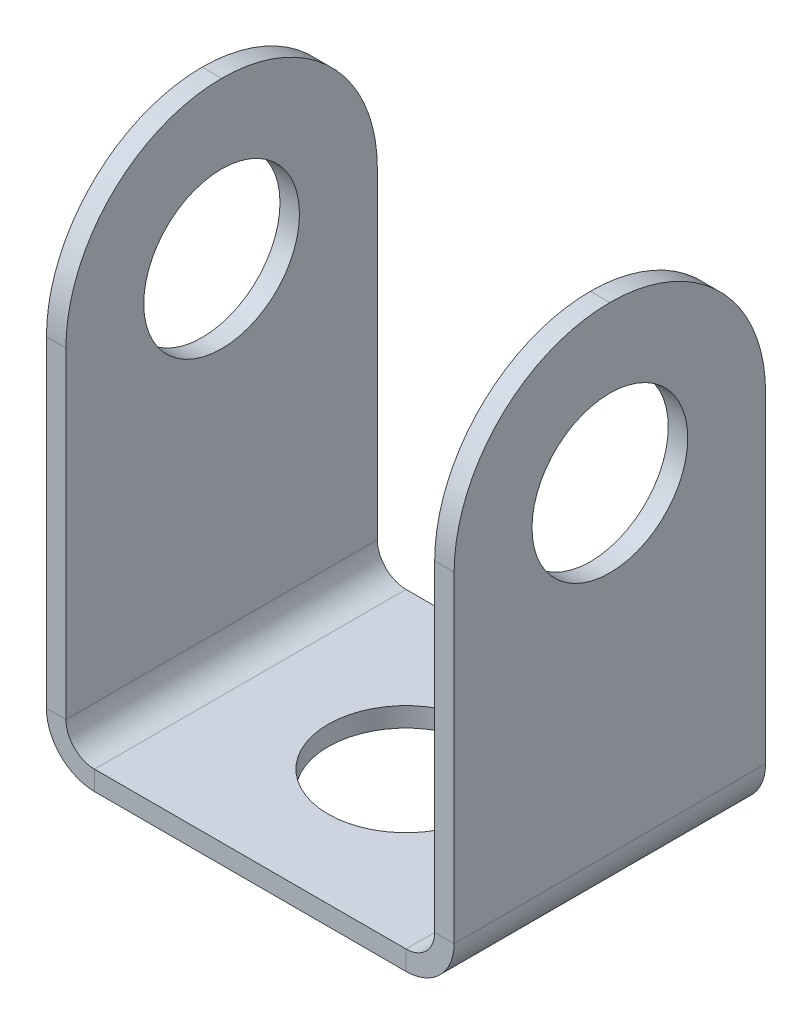
ISO-10303-21;
HEADER;
FILE_DESCRIPTION(('STEP AP214'),'2;1');
FILE_NAME('part.step','',(''),(''),'','','');
FILE_SCHEMA(('AUTOMOTIVE_DESIGN { 1 0 10303 214 1 1 1 1 }'));
ENDSEC;
DATA;
#1=APPLICATION_CONTEXT('core data for automotive mechanical design processes');
#2=APPLICATION_PROTOCOL_DEFINITION('international standard','automotive_design',2000,#1);
#3=PRODUCT_CONTEXT('',#1,'mechanical');
#4=PRODUCT('Part','Part','',(#3));
#5=PRODUCT_RELATED_PRODUCT_CATEGORY('part','',(#4));
#6=PRODUCT_DEFINITION_FORMATION('','',#4);
#7=PRODUCT_DEFINITION_CONTEXT('part definition',#1,'design');
#8=PRODUCT_DEFINITION('design','',#6,#7);
#9=PRODUCT_DEFINITION_SHAPE('','',#8);
#10=(LENGTH_UNIT() NAMED_UNIT(*) SI_UNIT(.MILLI.,.METRE.));
#11=(NAMED_UNIT(*) PLANE_ANGLE_UNIT() SI_UNIT($,.RADIAN.));
#12=(NAMED_UNIT(*) SI_UNIT($,.STERADIAN.) SOLID_ANGLE_UNIT());
#13=UNCERTAINTY_MEASURE_WITH_UNIT(LENGTH_MEASURE(1.E-05),#10,'distance_accuracy_value','');
#14=(GEOMETRIC_REPRESENTATION_CONTEXT(3) GLOBAL_UNCERTAINTY_ASSIGNED_CONTEXT((#13)) GLOBAL_UNIT_ASSIGNED_CONTEXT((#10,
#11,#12)) REPRESENTATION_CONTEXT('',''));
#15=CARTESIAN_POINT('',(0.,0.,0.));
#16=DIRECTION('',(0.,0.,1.));
#17=DIRECTION('',(1.,0.,0.));
#18=AXIS2_PLACEMENT_3D('',#15,#16,#17);
#19=CARTESIAN_POINT('',(-4.,0.5,-4.));
#20=DIRECTION('',(0.,0.,1.));
#21=DIRECTION('',(1.,0.,0.));
#22=AXIS2_PLACEMENT_3D('',#19,#20,#21);
#23=PLANE('',#22);
#24=DIRECTION('',(-1.,0.,0.));
#25=VECTOR('',#24,1.);
#26=CARTESIAN_POINT('',(-4.,0.,-4.));
#27=LINE('',#26,#25);
#28=CARTESIAN_POINT('',(4.,0.,-4.));
#29=VERTEX_POINT('',#28);
#30=CARTESIAN_POINT('',(-4.,0.,-4.));
#31=VERTEX_POINT('',#30);
#32=EDGE_CURVE('E276',#29,#31,#27,.T.);
#33=ORIENTED_EDGE('',*,*,#32,.T.);
#34=DIRECTION('',(0.,-1.,0.));
#35=VECTOR('',#34,1.);
#36=CARTESIAN_POINT('',(-4.,0.5,-4.));
#37=LINE('',#36,#35);
#38=CARTESIAN_POINT('',(-4.,0.5,-4.));
#39=VERTEX_POINT('',#38);
#40=EDGE_CURVE('E285',#39,#31,#37,.T.);
#41=ORIENTED_EDGE('',*,*,#40,.F.);
#42=DIRECTION('',(-1.,0.,0.));
#43=VECTOR('',#42,1.);
#44=CARTESIAN_POINT('',(-4.,0.5,-4.));
#45=LINE('',#44,#43);
#46=CARTESIAN_POINT('',(4.,0.5,-4.));
#47=VERTEX_POINT('',#46);
#48=EDGE_CURVE('E266',#47,#39,#45,.T.);
#49=ORIENTED_EDGE('',*,*,#48,.F.);
#50=DIRECTION('',(0.,-1.,0.));
#51=VECTOR('',#50,1.);
#52=CARTESIAN_POINT('',(4.,0.5,-4.));
#53=LINE('',#52,#51);
#54=EDGE_CURVE('E288',#47,#29,#53,.T.);
#55=ORIENTED_EDGE('',*,*,#54,.T.);
#56=EDGE_LOOP('',(#33,#41,#49,#55));
#57=FACE_BOUND('',#56,.T.);
#58=ADVANCED_FACE('F77',(#57),#23,.F.);
#59=CARTESIAN_POINT('',(-4.,0.5,4.));
#60=DIRECTION('',(0.,0.,-1.));
#61=DIRECTION('',(-1.,0.,0.));
#62=AXIS2_PLACEMENT_3D('',#59,#60,#61);
#63=PLANE('',#62);
#64=DIRECTION('',(1.,0.,0.));
#65=VECTOR('',#64,1.);
#66=CARTESIAN_POINT('',(-4.,0.,4.));
#67=LINE('',#66,#65);
#68=CARTESIAN_POINT('',(-4.,0.,4.));
#69=VERTEX_POINT('',#68);
#70=CARTESIAN_POINT('',(4.,0.,4.));
#71=VERTEX_POINT('',#70);
#72=EDGE_CURVE('E267',#69,#71,#67,.T.);
#73=ORIENTED_EDGE('',*,*,#72,.T.);
#74=DIRECTION('',(0.,-1.,0.));
#75=VECTOR('',#74,1.);
#76=CARTESIAN_POINT('',(4.,0.5,4.));
#77=LINE('',#76,#75);
#78=CARTESIAN_POINT('',(4.,0.5,4.));
#79=VERTEX_POINT('',#78);
#80=EDGE_CURVE('E273',#79,#71,#77,.T.);
#81=ORIENTED_EDGE('',*,*,#80,.F.);
#82=DIRECTION('',(1.,0.,0.));
#83=VECTOR('',#82,1.);
#84=CARTESIAN_POINT('',(-4.,0.5,4.));
#85=LINE('',#84,#83);
#86=CARTESIAN_POINT('',(-4.,0.5,4.));
#87=VERTEX_POINT('',#86);
#88=EDGE_CURVE('E271',#87,#79,#85,.T.);
#89=ORIENTED_EDGE('',*,*,#88,.F.);
#90=DIRECTION('',(0.,-1.,0.));
#91=VECTOR('',#90,1.);
#92=CARTESIAN_POINT('',(-4.,0.5,4.));
#93=LINE('',#92,#91);
#94=EDGE_CURVE('E282',#87,#69,#93,.T.);
#95=ORIENTED_EDGE('',*,*,#94,.T.);
#96=EDGE_LOOP('',(#73,#81,#89,#95));
#97=FACE_BOUND('',#96,.T.);
#98=ADVANCED_FACE('F363',(#97),#63,.F.);
#99=CARTESIAN_POINT('',(0.,0.5,0.));
#100=DIRECTION('',(0.,1.,0.));
#101=DIRECTION('',(0.,0.,1.));
#102=AXIS2_PLACEMENT_3D('',#99,#100,#101);
#103=PLANE('',#102);
#104=CARTESIAN_POINT('',(0.,0.5,0.));
#105=DIRECTION('',(0.,1.,0.));
#106=DIRECTION('',(0.,0.,1.));
#107=AXIS2_PLACEMENT_3D('',#104,#105,#106);
#108=CIRCLE('',#107,2.);
#109=CARTESIAN_POINT('',(0.,0.5,2.));
#110=VERTEX_POINT('',#109);
#111=EDGE_CURVE('E216',#110,#110,#108,.T.);
#112=ORIENTED_EDGE('',*,*,#111,.F.);
#113=EDGE_LOOP('',(#112));
#114=FACE_BOUND('',#113,.T.);
#115=DIRECTION('',(0.,0.,-1.));
#116=VECTOR('',#115,1.);
#117=CARTESIAN_POINT('',(4.,0.5,-4.));
#118=LINE('',#117,#116);
#119=EDGE_CURVE('E263',#79,#47,#118,.T.);
#120=ORIENTED_EDGE('',*,*,#119,.T.);
#121=ORIENTED_EDGE('',*,*,#48,.T.);
#122=DIRECTION('',(0.,0.,1.));
#123=VECTOR('',#122,1.);
#124=CARTESIAN_POINT('',(-4.,0.5,-4.));
#125=LINE('',#124,#123);
#126=EDGE_CURVE('E269',#39,#87,#125,.T.);
#127=ORIENTED_EDGE('',*,*,#126,.T.);
#128=ORIENTED_EDGE('',*,*,#88,.T.);
#129=EDGE_LOOP('',(#120,#121,#127,#128));
#130=FACE_BOUND('',#129,.T.);
#131=ADVANCED_FACE('F359',(#114,#130),#103,.T.);
#132=CARTESIAN_POINT('',(0.,0.,0.));
#133=DIRECTION('',(0.,1.,0.));
#134=DIRECTION('',(0.,0.,1.));
#135=AXIS2_PLACEMENT_3D('',#132,#133,#134);
#136=PLANE('',#135);
#137=CARTESIAN_POINT('',(0.,0.,0.));
#138=DIRECTION('',(0.,1.,0.));
#139=DIRECTION('',(0.,0.,1.));
#140=AXIS2_PLACEMENT_3D('',#137,#138,#139);
#141=CIRCLE('',#140,2.);
#142=CARTESIAN_POINT('',(0.,0.,2.));
#143=VERTEX_POINT('',#142);
#144=EDGE_CURVE('E315',#143,#143,#141,.T.);
#145=ORIENTED_EDGE('',*,*,#144,.T.);
#146=EDGE_LOOP('',(#145));
#147=FACE_BOUND('',#146,.T.);
#148=DIRECTION('',(0.,0.,-1.));
#149=VECTOR('',#148,1.);
#150=CARTESIAN_POINT('',(4.,0.,-4.));
#151=LINE('',#150,#149);
#152=EDGE_CURVE('E254',#71,#29,#151,.T.);
#153=ORIENTED_EDGE('',*,*,#152,.F.);
#154=ORIENTED_EDGE('',*,*,#72,.F.);
#155=DIRECTION('',(0.,0.,1.));
#156=VECTOR('',#155,1.);
#157=CARTESIAN_POINT('',(-4.,0.,-4.));
#158=LINE('',#157,#156);
#159=EDGE_CURVE('E189',#31,#69,#158,.T.);
#160=ORIENTED_EDGE('',*,*,#159,.F.);
#161=ORIENTED_EDGE('',*,*,#32,.F.);
#162=EDGE_LOOP('',(#153,#154,#160,#161));
#163=FACE_BOUND('',#162,.T.);
#164=ADVANCED_FACE('F405',(#147,#163),#136,.F.);
#165=CARTESIAN_POINT('',(4.,1.2366,4.));
#166=DIRECTION('',(0.,0.,1.));
#167=DIRECTION('',(0.,-1.,0.));
#168=AXIS2_PLACEMENT_3D('',#165,#166,#167);
#169=PLANE('',#168);
#170=DIRECTION('',(-1.,0.,0.));
#171=VECTOR('',#170,1.);
#172=CARTESIAN_POINT('',(5.2366,1.2366,4.));
#173=LINE('',#172,#171);
#174=CARTESIAN_POINT('',(4.7366,1.2366,4.));
#175=VERTEX_POINT('',#174);
#176=CARTESIAN_POINT('',(5.2366,1.2366,4.));
#177=VERTEX_POINT('',#176);
#178=EDGE_CURVE('E226',#175,#177,#173,.F.);
#179=ORIENTED_EDGE('',*,*,#178,.F.);
#180=CARTESIAN_POINT('',(4.,1.2366,4.));
#181=DIRECTION('',(0.,0.,-1.));
#182=DIRECTION('',(0.,1.,0.));
#183=AXIS2_PLACEMENT_3D('',#180,#181,#182);
#184=CIRCLE('',#183,0.736600000000001);
#185=EDGE_CURVE('E258',#79,#175,#184,.F.);
#186=ORIENTED_EDGE('',*,*,#185,.F.);
#187=ORIENTED_EDGE('',*,*,#80,.T.);
#188=CARTESIAN_POINT('',(4.,1.2366,4.));
#189=DIRECTION('',(0.,0.,-1.));
#190=DIRECTION('',(0.,1.,0.));
#191=AXIS2_PLACEMENT_3D('',#188,#189,#190);
#192=CIRCLE('',#191,1.2366);
#193=EDGE_CURVE('E251',#71,#177,#192,.F.);
#194=ORIENTED_EDGE('',*,*,#193,.T.);
#195=EDGE_LOOP('',(#179,#186,#187,#194));
#196=FACE_BOUND('',#195,.T.);
#197=ADVANCED_FACE('F375',(#196),#169,.T.);
#198=CARTESIAN_POINT('',(4.,1.2366,-4.));
#199=DIRECTION('',(0.,0.,1.));
#200=DIRECTION('',(0.,-1.,0.));
#201=AXIS2_PLACEMENT_3D('',#198,#199,#200);
#202=PLANE('',#201);
#203=CARTESIAN_POINT('',(4.,1.2366,-4.));
#204=DIRECTION('',(0.,0.,-1.));
#205=DIRECTION('',(0.,1.,0.));
#206=AXIS2_PLACEMENT_3D('',#203,#204,#205);
#207=CIRCLE('',#206,0.736600000000001);
#208=CARTESIAN_POINT('',(4.7366,1.2366,-4.));
#209=VERTEX_POINT('',#208);
#210=EDGE_CURVE('E233',#209,#47,#207,.T.);
#211=ORIENTED_EDGE('',*,*,#210,.F.);
#212=DIRECTION('',(-1.,0.,0.));
#213=VECTOR('',#212,1.);
#214=CARTESIAN_POINT('',(4.7366,1.2366,-4.));
#215=LINE('',#214,#213);
#216=CARTESIAN_POINT('',(5.2366,1.23659999999999,-4.));
#217=VERTEX_POINT('',#216);
#218=EDGE_CURVE('E244',#209,#217,#215,.F.);
#219=ORIENTED_EDGE('',*,*,#218,.T.);
#220=CARTESIAN_POINT('',(4.,1.2366,-4.));
#221=DIRECTION('',(0.,0.,-1.));
#222=DIRECTION('',(0.,1.,0.));
#223=AXIS2_PLACEMENT_3D('',#220,#221,#222);
#224=CIRCLE('',#223,1.2366);
#225=EDGE_CURVE('E255',#217,#29,#224,.T.);
#226=ORIENTED_EDGE('',*,*,#225,.T.);
#227=ORIENTED_EDGE('',*,*,#54,.F.);
#228=EDGE_LOOP('',(#211,#219,#226,#227));
#229=FACE_BOUND('',#228,.T.);
#230=ADVANCED_FACE('F398',(#229),#202,.F.);
#231=CARTESIAN_POINT('',(4.,1.2366,-4.));
#232=DIRECTION('',(0.,0.,-1.));
#233=DIRECTION('',(1.,0.,0.));
#234=AXIS2_PLACEMENT_3D('',#231,#232,#233);
#235=CYLINDRICAL_SURFACE('',#234,1.2366);
#236=ORIENTED_EDGE('',*,*,#152,.T.);
#237=ORIENTED_EDGE('',*,*,#225,.F.);
#238=DIRECTION('',(0.,0.,-1.));
#239=VECTOR('',#238,1.);
#240=CARTESIAN_POINT('',(5.2366,1.2366,4.));
#241=LINE('',#240,#239);
#242=EDGE_CURVE('E241',#217,#177,#241,.F.);
#243=ORIENTED_EDGE('',*,*,#242,.T.);
#244=ORIENTED_EDGE('',*,*,#193,.F.);
#245=EDGE_LOOP('',(#236,#237,#243,#244));
#246=FACE_BOUND('',#245,.T.);
#247=ADVANCED_FACE('F402',(#246),#235,.T.);
#248=CARTESIAN_POINT('',(4.,1.2366,-4.));
#249=DIRECTION('',(0.,0.,-1.));
#250=DIRECTION('',(1.,0.,0.));
#251=AXIS2_PLACEMENT_3D('',#248,#249,#250);
#252=CYLINDRICAL_SURFACE('',#251,0.736600000000001);
#253=ORIENTED_EDGE('',*,*,#119,.F.);
#254=ORIENTED_EDGE('',*,*,#185,.T.);
#255=DIRECTION('',(0.,0.,-1.));
#256=VECTOR('',#255,1.);
#257=CARTESIAN_POINT('',(4.7366,1.2366,4.));
#258=LINE('',#257,#256);
#259=EDGE_CURVE('E247',#175,#209,#258,.T.);
#260=ORIENTED_EDGE('',*,*,#259,.T.);
#261=ORIENTED_EDGE('',*,*,#210,.T.);
#262=EDGE_LOOP('',(#253,#254,#260,#261));
#263=FACE_BOUND('',#262,.T.);
#264=ADVANCED_FACE('F370',(#263),#252,.F.);
#265=CARTESIAN_POINT('',(5.2366,0.499999999999998,4.));
#266=DIRECTION('',(0.,0.,-1.));
#267=DIRECTION('',(-1.,0.,0.));
#268=AXIS2_PLACEMENT_3D('',#265,#266,#267);
#269=PLANE('',#268);
#270=DIRECTION('',(0.,-1.,0.));
#271=VECTOR('',#270,1.);
#272=CARTESIAN_POINT('',(5.23659999999999,0.,4.));
#273=LINE('',#272,#271);
#274=CARTESIAN_POINT('',(5.23660000000003,9.5,4.));
#275=VERTEX_POINT('',#274);
#276=EDGE_CURVE('E234',#275,#177,#273,.T.);
#277=ORIENTED_EDGE('',*,*,#276,.F.);
#278=DIRECTION('',(-1.,0.,0.));
#279=VECTOR('',#278,1.);
#280=CARTESIAN_POINT('',(5.23660000000003,9.5,4.));
#281=LINE('',#280,#279);
#282=CARTESIAN_POINT('',(4.73660000000003,9.5,4.));
#283=VERTEX_POINT('',#282);
#284=EDGE_CURVE('E86',#275,#283,#281,.T.);
#285=ORIENTED_EDGE('',*,*,#284,.T.);
#286=DIRECTION('',(0.,1.,0.));
#287=VECTOR('',#286,1.);
#288=CARTESIAN_POINT('',(4.7366,0.5,4.));
#289=LINE('',#288,#287);
#290=EDGE_CURVE('E239',#283,#175,#289,.F.);
#291=ORIENTED_EDGE('',*,*,#290,.T.);
#292=ORIENTED_EDGE('',*,*,#178,.T.);
#293=EDGE_LOOP('',(#277,#285,#291,#292));
#294=FACE_BOUND('',#293,.T.);
#295=ADVANCED_FACE('F378',(#294),#269,.F.);
#296=CARTESIAN_POINT('',(5.23660000000004,13.5,-4.));
#297=DIRECTION('',(0.,0.,1.));
#298=DIRECTION('',(1.,0.,0.));
#299=AXIS2_PLACEMENT_3D('',#296,#297,#298);
#300=PLANE('',#299);
#301=DIRECTION('',(0.,-1.,0.));
#302=VECTOR('',#301,1.);
#303=CARTESIAN_POINT('',(4.73660000000004,13.5,-4.));
#304=LINE('',#303,#302);
#305=CARTESIAN_POINT('',(4.73660000000003,9.5,-4.));
#306=VERTEX_POINT('',#305);
#307=EDGE_CURVE('E236',#209,#306,#304,.F.);
#308=ORIENTED_EDGE('',*,*,#307,.T.);
#309=DIRECTION('',(-1.,0.,0.));
#310=VECTOR('',#309,1.);
#311=CARTESIAN_POINT('',(5.23660000000003,9.5,-4.));
#312=LINE('',#311,#310);
#313=CARTESIAN_POINT('',(5.23660000000003,9.5,-4.));
#314=VERTEX_POINT('',#313);
#315=EDGE_CURVE('E294',#306,#314,#312,.F.);
#316=ORIENTED_EDGE('',*,*,#315,.T.);
#317=DIRECTION('',(0.,1.,0.));
#318=VECTOR('',#317,1.);
#319=CARTESIAN_POINT('',(5.23659999999999,0.,-4.));
#320=LINE('',#319,#318);
#321=EDGE_CURVE('E230',#217,#314,#320,.T.);
#322=ORIENTED_EDGE('',*,*,#321,.F.);
#323=ORIENTED_EDGE('',*,*,#218,.F.);
#324=EDGE_LOOP('',(#308,#316,#322,#323));
#325=FACE_BOUND('',#324,.T.);
#326=ADVANCED_FACE('F394',(#325),#300,.F.);
#327=CARTESIAN_POINT('',(5.23659999999999,0.,0.));
#328=DIRECTION('',(-1.,0.,0.));
#329=DIRECTION('',(0.,-1.,0.));
#330=AXIS2_PLACEMENT_3D('',#327,#328,#329);
#331=PLANE('',#330);
#332=CARTESIAN_POINT('',(5.23660000000003,9.48444492898578,0.));
#333=DIRECTION('',(1.,0.,0.));
#334=DIRECTION('',(0.,1.,0.));
#335=AXIS2_PLACEMENT_3D('',#332,#333,#334);
#336=CIRCLE('',#335,2.);
#337=CARTESIAN_POINT('',(5.23660000000003,11.4844449289858,0.));
#338=VERTEX_POINT('',#337);
#339=EDGE_CURVE('E326',#338,#338,#336,.T.);
#340=ORIENTED_EDGE('',*,*,#339,.F.);
#341=EDGE_LOOP('',(#340));
#342=FACE_BOUND('',#341,.T.);
#343=ORIENTED_EDGE('',*,*,#321,.T.);
#344=CARTESIAN_POINT('',(5.23660000000003,9.5,0.));
#345=DIRECTION('',(-1.,0.,0.));
#346=DIRECTION('',(0.,-1.,0.));
#347=AXIS2_PLACEMENT_3D('',#344,#345,#346);
#348=CIRCLE('',#347,4.);
#349=CARTESIAN_POINT('',(5.23660000000004,13.5,0.));
#350=VERTEX_POINT('',#349);
#351=EDGE_CURVE('E299',#314,#350,#348,.F.);
#352=ORIENTED_EDGE('',*,*,#351,.T.);
#353=CARTESIAN_POINT('',(5.23660000000003,9.5,0.));
#354=DIRECTION('',(-1.,0.,0.));
#355=DIRECTION('',(0.,-1.,0.));
#356=AXIS2_PLACEMENT_3D('',#353,#354,#355);
#357=CIRCLE('',#356,4.);
#358=EDGE_CURVE('E297',#350,#275,#357,.F.);
#359=ORIENTED_EDGE('',*,*,#358,.T.);
#360=ORIENTED_EDGE('',*,*,#276,.T.);
#361=ORIENTED_EDGE('',*,*,#242,.F.);
#362=EDGE_LOOP('',(#343,#352,#359,#360,#361));
#363=FACE_BOUND('',#362,.T.);
#364=ADVANCED_FACE('F400',(#342,#363),#331,.F.);
#365=CARTESIAN_POINT('',(4.7366,0.,0.));
#366=DIRECTION('',(-1.,0.,0.));
#367=DIRECTION('',(0.,-1.,0.));
#368=AXIS2_PLACEMENT_3D('',#365,#366,#367);
#369=PLANE('',#368);
#370=CARTESIAN_POINT('',(4.73660000000003,9.48444492898578,0.));
#371=DIRECTION('',(-1.,0.,0.));
#372=DIRECTION('',(0.,-1.,0.));
#373=AXIS2_PLACEMENT_3D('',#370,#371,#372);
#374=CIRCLE('',#373,2.);
#375=CARTESIAN_POINT('',(4.73660000000003,11.4844449289858,0.));
#376=VERTEX_POINT('',#375);
#377=EDGE_CURVE('E322',#376,#376,#374,.T.);
#378=ORIENTED_EDGE('',*,*,#377,.F.);
#379=EDGE_LOOP('',(#378));
#380=FACE_BOUND('',#379,.T.);
#381=CARTESIAN_POINT('',(4.73660000000003,9.5,0.));
#382=DIRECTION('',(-1.,0.,0.));
#383=DIRECTION('',(0.,-1.,0.));
#384=AXIS2_PLACEMENT_3D('',#381,#382,#383);
#385=CIRCLE('',#384,4.);
#386=CARTESIAN_POINT('',(4.73660000000004,13.5,0.));
#387=VERTEX_POINT('',#386);
#388=EDGE_CURVE('E290',#283,#387,#385,.T.);
#389=ORIENTED_EDGE('',*,*,#388,.T.);
#390=CARTESIAN_POINT('',(4.73660000000003,9.5,0.));
#391=DIRECTION('',(-1.,0.,0.));
#392=DIRECTION('',(0.,-1.,0.));
#393=AXIS2_PLACEMENT_3D('',#390,#391,#392);
#394=CIRCLE('',#393,4.);
#395=EDGE_CURVE('E292',#387,#306,#394,.T.);
#396=ORIENTED_EDGE('',*,*,#395,.T.);
#397=ORIENTED_EDGE('',*,*,#307,.F.);
#398=ORIENTED_EDGE('',*,*,#259,.F.);
#399=ORIENTED_EDGE('',*,*,#290,.F.);
#400=EDGE_LOOP('',(#389,#396,#397,#398,#399));
#401=FACE_BOUND('',#400,.T.);
#402=ADVANCED_FACE('F383',(#380,#401),#369,.T.);
#403=CARTESIAN_POINT('',(-4.,1.2366,-4.));
#404=DIRECTION('',(0.,0.,-1.));
#405=DIRECTION('',(-1.,0.,0.));
#406=AXIS2_PLACEMENT_3D('',#403,#404,#405);
#407=PLANE('',#406);
#408=DIRECTION('',(1.,0.,0.));
#409=VECTOR('',#408,1.);
#410=CARTESIAN_POINT('',(-5.2366,1.2366,-4.));
#411=LINE('',#410,#409);
#412=CARTESIAN_POINT('',(-4.7366,1.2366,-4.));
#413=VERTEX_POINT('',#412);
#414=CARTESIAN_POINT('',(-5.2366,1.2366,-4.));
#415=VERTEX_POINT('',#414);
#416=EDGE_CURVE('E222',#413,#415,#411,.F.);
#417=ORIENTED_EDGE('',*,*,#416,.F.);
#418=CARTESIAN_POINT('',(-4.,1.2366,-4.));
#419=DIRECTION('',(0.,0.,1.));
#420=DIRECTION('',(1.,0.,0.));
#421=AXIS2_PLACEMENT_3D('',#418,#419,#420);
#422=CIRCLE('',#421,0.7366);
#423=EDGE_CURVE('E193',#39,#413,#422,.F.);
#424=ORIENTED_EDGE('',*,*,#423,.F.);
#425=ORIENTED_EDGE('',*,*,#40,.T.);
#426=CARTESIAN_POINT('',(-4.,1.2366,-4.));
#427=DIRECTION('',(0.,0.,1.));
#428=DIRECTION('',(1.,0.,0.));
#429=AXIS2_PLACEMENT_3D('',#426,#427,#428);
#430=CIRCLE('',#429,1.2366);
#431=EDGE_CURVE('E192',#31,#415,#430,.F.);
#432=ORIENTED_EDGE('',*,*,#431,.T.);
#433=EDGE_LOOP('',(#417,#424,#425,#432));
#434=FACE_BOUND('',#433,.T.);
#435=ADVANCED_FACE('F353',(#434),#407,.T.);
#436=CARTESIAN_POINT('',(-4.,1.2366,4.));
#437=DIRECTION('',(0.,0.,-1.));
#438=DIRECTION('',(-1.,0.,0.));
#439=AXIS2_PLACEMENT_3D('',#436,#437,#438);
#440=PLANE('',#439);
#441=CARTESIAN_POINT('',(-4.,1.2366,4.));
#442=DIRECTION('',(0.,0.,1.));
#443=DIRECTION('',(1.,0.,0.));
#444=AXIS2_PLACEMENT_3D('',#441,#442,#443);
#445=CIRCLE('',#444,0.7366);
#446=CARTESIAN_POINT('',(-4.7366,1.2366,4.));
#447=VERTEX_POINT('',#446);
#448=EDGE_CURVE('E200',#447,#87,#445,.T.);
#449=ORIENTED_EDGE('',*,*,#448,.F.);
#450=DIRECTION('',(1.,0.,0.));
#451=VECTOR('',#450,1.);
#452=CARTESIAN_POINT('',(-4.7366,1.2366,4.));
#453=LINE('',#452,#451);
#454=CARTESIAN_POINT('',(-5.2366,1.2366,4.));
#455=VERTEX_POINT('',#454);
#456=EDGE_CURVE('E197',#447,#455,#453,.F.);
#457=ORIENTED_EDGE('',*,*,#456,.T.);
#458=CARTESIAN_POINT('',(-4.,1.2366,4.));
#459=DIRECTION('',(0.,0.,1.));
#460=DIRECTION('',(1.,0.,0.));
#461=AXIS2_PLACEMENT_3D('',#458,#459,#460);
#462=CIRCLE('',#461,1.2366);
#463=EDGE_CURVE('E181',#455,#69,#462,.T.);
#464=ORIENTED_EDGE('',*,*,#463,.T.);
#465=ORIENTED_EDGE('',*,*,#94,.F.);
#466=EDGE_LOOP('',(#449,#457,#464,#465));
#467=FACE_BOUND('',#466,.T.);
#468=ADVANCED_FACE('F198',(#467),#440,.F.);
#469=CARTESIAN_POINT('',(-4.,1.2366,4.));
#470=DIRECTION('',(0.,0.,1.));
#471=DIRECTION('',(-1.,0.,0.));
#472=AXIS2_PLACEMENT_3D('',#469,#470,#471);
#473=CYLINDRICAL_SURFACE('',#472,1.2366);
#474=ORIENTED_EDGE('',*,*,#159,.T.);
#475=ORIENTED_EDGE('',*,*,#463,.F.);
#476=DIRECTION('',(0.,0.,1.));
#477=VECTOR('',#476,1.);
#478=CARTESIAN_POINT('',(-5.2366,1.2366,-4.));
#479=LINE('',#478,#477);
#480=EDGE_CURVE('E186',#455,#415,#479,.F.);
#481=ORIENTED_EDGE('',*,*,#480,.T.);
#482=ORIENTED_EDGE('',*,*,#431,.F.);
#483=EDGE_LOOP('',(#474,#475,#481,#482));
#484=FACE_BOUND('',#483,.T.);
#485=ADVANCED_FACE('F183',(#484),#473,.T.);
#486=CARTESIAN_POINT('',(-4.,1.2366,4.));
#487=DIRECTION('',(0.,0.,1.));
#488=DIRECTION('',(-1.,0.,0.));
#489=AXIS2_PLACEMENT_3D('',#486,#487,#488);
#490=CYLINDRICAL_SURFACE('',#489,0.7366);
#491=ORIENTED_EDGE('',*,*,#126,.F.);
#492=ORIENTED_EDGE('',*,*,#423,.T.);
#493=DIRECTION('',(0.,0.,1.));
#494=VECTOR('',#493,1.);
#495=CARTESIAN_POINT('',(-4.7366,1.2366,-4.));
#496=LINE('',#495,#494);
#497=EDGE_CURVE('E202',#413,#447,#496,.T.);
#498=ORIENTED_EDGE('',*,*,#497,.T.);
#499=ORIENTED_EDGE('',*,*,#448,.T.);
#500=EDGE_LOOP('',(#491,#492,#498,#499));
#501=FACE_BOUND('',#500,.T.);
#502=ADVANCED_FACE('F356',(#501),#490,.F.);
#503=CARTESIAN_POINT('',(-5.2366,0.499999999999998,-4.));
#504=DIRECTION('',(0.,0.,1.));
#505=DIRECTION('',(0.,-1.,0.));
#506=AXIS2_PLACEMENT_3D('',#503,#504,#505);
#507=PLANE('',#506);
#508=DIRECTION('',(0.,-1.,0.));
#509=VECTOR('',#508,1.);
#510=CARTESIAN_POINT('',(-5.2366,0.,-4.));
#511=LINE('',#510,#509);
#512=CARTESIAN_POINT('',(-5.23660000000003,9.5,-4.));
#513=VERTEX_POINT('',#512);
#514=EDGE_CURVE('E207',#513,#415,#511,.T.);
#515=ORIENTED_EDGE('',*,*,#514,.F.);
#516=DIRECTION('',(1.,0.,0.));
#517=VECTOR('',#516,1.);
#518=CARTESIAN_POINT('',(-5.23660000000003,9.5,-4.));
#519=LINE('',#518,#517);
#520=CARTESIAN_POINT('',(-4.73660000000003,9.5,-4.));
#521=VERTEX_POINT('',#520);
#522=EDGE_CURVE('E301',#513,#521,#519,.T.);
#523=ORIENTED_EDGE('',*,*,#522,.T.);
#524=DIRECTION('',(0.,1.,0.));
#525=VECTOR('',#524,1.);
#526=CARTESIAN_POINT('',(-4.7366,0.5,-4.));
#527=LINE('',#526,#525);
#528=EDGE_CURVE('E208',#521,#413,#527,.F.);
#529=ORIENTED_EDGE('',*,*,#528,.T.);
#530=ORIENTED_EDGE('',*,*,#416,.T.);
#531=EDGE_LOOP('',(#515,#523,#529,#530));
#532=FACE_BOUND('',#531,.T.);
#533=ADVANCED_FACE('F349',(#532),#507,.F.);
#534=CARTESIAN_POINT('',(-5.23660000000004,13.5,4.));
#535=DIRECTION('',(0.,0.,-1.));
#536=DIRECTION('',(0.,1.,0.));
#537=AXIS2_PLACEMENT_3D('',#534,#535,#536);
#538=PLANE('',#537);
#539=DIRECTION('',(0.,-1.,0.));
#540=VECTOR('',#539,1.);
#541=CARTESIAN_POINT('',(-4.73660000000004,13.5,4.));
#542=LINE('',#541,#540);
#543=CARTESIAN_POINT('',(-4.73660000000003,9.5,4.));
#544=VERTEX_POINT('',#543);
#545=EDGE_CURVE('E213',#447,#544,#542,.F.);
#546=ORIENTED_EDGE('',*,*,#545,.T.);
#547=DIRECTION('',(1.,0.,0.));
#548=VECTOR('',#547,1.);
#549=CARTESIAN_POINT('',(-5.23660000000003,9.5,4.));
#550=LINE('',#549,#548);
#551=CARTESIAN_POINT('',(-5.23660000000003,9.5,4.));
#552=VERTEX_POINT('',#551);
#553=EDGE_CURVE('E13',#544,#552,#550,.F.);
#554=ORIENTED_EDGE('',*,*,#553,.T.);
#555=DIRECTION('',(0.,1.,0.));
#556=VECTOR('',#555,1.);
#557=CARTESIAN_POINT('',(-5.2366,0.,4.));
#558=LINE('',#557,#556);
#559=EDGE_CURVE('E205',#455,#552,#558,.T.);
#560=ORIENTED_EDGE('',*,*,#559,.F.);
#561=ORIENTED_EDGE('',*,*,#456,.F.);
#562=EDGE_LOOP('',(#546,#554,#560,#561));
#563=FACE_BOUND('',#562,.T.);
#564=ADVANCED_FACE('F210',(#563),#538,.F.);
#565=CARTESIAN_POINT('',(-5.2366,0.,0.));
#566=DIRECTION('',(1.,0.,0.));
#567=DIRECTION('',(0.,1.,0.));
#568=AXIS2_PLACEMENT_3D('',#565,#566,#567);
#569=PLANE('',#568);
#570=CARTESIAN_POINT('',(-5.23660000000006,9.48444492898582,0.));
#571=DIRECTION('',(1.,0.,0.));
#572=DIRECTION('',(0.,1.,0.));
#573=AXIS2_PLACEMENT_3D('',#570,#571,#572);
#574=CIRCLE('',#573,2.);
#575=CARTESIAN_POINT('',(-5.23660000000005,11.4844449289858,0.));
#576=VERTEX_POINT('',#575);
#577=EDGE_CURVE('E329',#576,#576,#574,.T.);
#578=ORIENTED_EDGE('',*,*,#577,.T.);
#579=EDGE_LOOP('',(#578));
#580=FACE_BOUND('',#579,.T.);
#581=CARTESIAN_POINT('',(-5.23660000000003,9.5,0.));
#582=DIRECTION('',(1.,0.,0.));
#583=DIRECTION('',(0.,1.,0.));
#584=AXIS2_PLACEMENT_3D('',#581,#582,#583);
#585=CIRCLE('',#584,4.);
#586=CARTESIAN_POINT('',(-5.23660000000004,13.5,0.));
#587=VERTEX_POINT('',#586);
#588=EDGE_CURVE('E94',#552,#587,#585,.F.);
#589=ORIENTED_EDGE('',*,*,#588,.T.);
#590=CARTESIAN_POINT('',(-5.23660000000003,9.5,0.));
#591=DIRECTION('',(1.,0.,0.));
#592=DIRECTION('',(0.,1.,0.));
#593=AXIS2_PLACEMENT_3D('',#590,#591,#592);
#594=CIRCLE('',#593,4.);
#595=EDGE_CURVE('E309',#587,#513,#594,.F.);
#596=ORIENTED_EDGE('',*,*,#595,.T.);
#597=ORIENTED_EDGE('',*,*,#514,.T.);
#598=ORIENTED_EDGE('',*,*,#480,.F.);
#599=ORIENTED_EDGE('',*,*,#559,.T.);
#600=EDGE_LOOP('',(#589,#596,#597,#598,#599));
#601=FACE_BOUND('',#600,.T.);
#602=ADVANCED_FACE('F204',(#580,#601),#569,.F.);
#603=CARTESIAN_POINT('',(-4.7366,0.,0.));
#604=DIRECTION('',(1.,0.,0.));
#605=DIRECTION('',(0.,1.,0.));
#606=AXIS2_PLACEMENT_3D('',#603,#604,#605);
#607=PLANE('',#606);
#608=CARTESIAN_POINT('',(-4.73660000000003,9.48444492898582,0.));
#609=DIRECTION('',(1.,0.,0.));
#610=DIRECTION('',(0.,1.,0.));
#611=AXIS2_PLACEMENT_3D('',#608,#609,#610);
#612=CIRCLE('',#611,2.);
#613=CARTESIAN_POINT('',(-4.73660000000004,11.4844449289858,0.));
#614=VERTEX_POINT('',#613);
#615=EDGE_CURVE('E81',#614,#614,#612,.T.);
#616=ORIENTED_EDGE('',*,*,#615,.F.);
#617=EDGE_LOOP('',(#616));
#618=FACE_BOUND('',#617,.T.);
#619=ORIENTED_EDGE('',*,*,#528,.F.);
#620=CARTESIAN_POINT('',(-4.73660000000003,9.5,0.));
#621=DIRECTION('',(1.,0.,0.));
#622=DIRECTION('',(0.,1.,0.));
#623=AXIS2_PLACEMENT_3D('',#620,#621,#622);
#624=CIRCLE('',#623,4.);
#625=CARTESIAN_POINT('',(-4.73660000000004,13.5,0.));
#626=VERTEX_POINT('',#625);
#627=EDGE_CURVE('E306',#521,#626,#624,.T.);
#628=ORIENTED_EDGE('',*,*,#627,.T.);
#629=CARTESIAN_POINT('',(-4.73660000000003,9.5,0.));
#630=DIRECTION('',(1.,0.,0.));
#631=DIRECTION('',(0.,1.,0.));
#632=AXIS2_PLACEMENT_3D('',#629,#630,#631);
#633=CIRCLE('',#632,4.);
#634=EDGE_CURVE('E304',#626,#544,#633,.T.);
#635=ORIENTED_EDGE('',*,*,#634,.T.);
#636=ORIENTED_EDGE('',*,*,#545,.F.);
#637=ORIENTED_EDGE('',*,*,#497,.F.);
#638=EDGE_LOOP('',(#619,#628,#635,#636,#637));
#639=FACE_BOUND('',#638,.T.);
#640=ADVANCED_FACE('F339',(#618,#639),#607,.T.);
#641=CARTESIAN_POINT('',(5.23660000000003,9.5,0.));
#642=DIRECTION('',(-1.,0.,0.));
#643=DIRECTION('',(0.,-1.,0.));
#644=AXIS2_PLACEMENT_3D('',#641,#642,#643);
#645=CYLINDRICAL_SURFACE('',#644,4.);
#646=ORIENTED_EDGE('',*,*,#284,.F.);
#647=ORIENTED_EDGE('',*,*,#358,.F.);
#648=DIRECTION('',(-1.,0.,0.));
#649=VECTOR('',#648,1.);
#650=CARTESIAN_POINT('',(5.23660000000004,13.5,0.));
#651=LINE('',#650,#649);
#652=EDGE_CURVE('E225',#387,#350,#651,.F.);
#653=ORIENTED_EDGE('',*,*,#652,.F.);
#654=ORIENTED_EDGE('',*,*,#388,.F.);
#655=EDGE_LOOP('',(#646,#647,#653,#654));
#656=FACE_BOUND('',#655,.T.);
#657=ADVANCED_FACE('F342',(#656),#645,.T.);
#658=CARTESIAN_POINT('',(5.23660000000003,9.5,0.));
#659=DIRECTION('',(-1.,0.,0.));
#660=DIRECTION('',(0.,-1.,0.));
#661=AXIS2_PLACEMENT_3D('',#658,#659,#660);
#662=CYLINDRICAL_SURFACE('',#661,4.);
#663=ORIENTED_EDGE('',*,*,#351,.F.);
#664=ORIENTED_EDGE('',*,*,#315,.F.);
#665=ORIENTED_EDGE('',*,*,#395,.F.);
#666=ORIENTED_EDGE('',*,*,#652,.T.);
#667=EDGE_LOOP('',(#663,#664,#665,#666));
#668=FACE_BOUND('',#667,.T.);
#669=ADVANCED_FACE('F391',(#668),#662,.T.);
#670=CARTESIAN_POINT('',(-5.23660000000003,9.5,0.));
#671=DIRECTION('',(1.,0.,0.));
#672=DIRECTION('',(0.,1.,0.));
#673=AXIS2_PLACEMENT_3D('',#670,#671,#672);
#674=CYLINDRICAL_SURFACE('',#673,4.);
#675=DIRECTION('',(1.,0.,0.));
#676=VECTOR('',#675,1.);
#677=CARTESIAN_POINT('',(-5.23660000000004,13.5,0.));
#678=LINE('',#677,#676);
#679=EDGE_CURVE('E313',#587,#626,#678,.T.);
#680=ORIENTED_EDGE('',*,*,#679,.F.);
#681=ORIENTED_EDGE('',*,*,#588,.F.);
#682=ORIENTED_EDGE('',*,*,#553,.F.);
#683=ORIENTED_EDGE('',*,*,#634,.F.);
#684=EDGE_LOOP('',(#680,#681,#682,#683));
#685=FACE_BOUND('',#684,.T.);
#686=ADVANCED_FACE('F79',(#685),#674,.T.);
#687=CARTESIAN_POINT('',(-5.23660000000003,9.5,0.));
#688=DIRECTION('',(1.,0.,0.));
#689=DIRECTION('',(0.,1.,0.));
#690=AXIS2_PLACEMENT_3D('',#687,#688,#689);
#691=CYLINDRICAL_SURFACE('',#690,4.);
#692=ORIENTED_EDGE('',*,*,#595,.F.);
#693=ORIENTED_EDGE('',*,*,#679,.T.);
#694=ORIENTED_EDGE('',*,*,#627,.F.);
#695=ORIENTED_EDGE('',*,*,#522,.F.);
#696=EDGE_LOOP('',(#692,#693,#694,#695));
#697=FACE_BOUND('',#696,.T.);
#698=ADVANCED_FACE('F418',(#697),#691,.T.);
#699=CARTESIAN_POINT('',(0.,0.,0.));
#700=DIRECTION('',(0.,1.,0.));
#701=DIRECTION('',(0.,0.,1.));
#702=AXIS2_PLACEMENT_3D('',#699,#700,#701);
#703=CYLINDRICAL_SURFACE('',#702,2.);
#704=ORIENTED_EDGE('',*,*,#144,.F.);
#705=EDGE_LOOP('',(#704));
#706=FACE_BOUND('',#705,.T.);
#707=ORIENTED_EDGE('',*,*,#111,.T.);
#708=EDGE_LOOP('',(#707));
#709=FACE_BOUND('',#708,.T.);
#710=ADVANCED_FACE('F420',(#706,#709),#703,.F.);
#711=CARTESIAN_POINT('',(-5.23660000000006,9.48444492898582,0.));
#712=DIRECTION('',(1.,0.,0.));
#713=DIRECTION('',(0.,1.,0.));
#714=AXIS2_PLACEMENT_3D('',#711,#712,#713);
#715=CYLINDRICAL_SURFACE('',#714,2.);
#716=CARTESIAN_POINT('',(-4.73660000000004,11.4844449289858,0.));
#717=CARTESIAN_POINT('',(-4.74180833333337,11.4844449289858,0.));
#718=CARTESIAN_POINT('',(-4.7470166666667,11.4844449289858,0.));
#719=CARTESIAN_POINT('',(-4.75743333333337,11.4844449289858,0.));
#720=CARTESIAN_POINT('',(-4.76264166666671,11.4844449289858,0.));
#721=CARTESIAN_POINT('',(-4.77305833333337,11.4844449289858,0.));
#722=CARTESIAN_POINT('',(-4.77826666666671,11.4844449289858,0.));
#723=CARTESIAN_POINT('',(-4.78868333333337,11.4844449289858,0.));
#724=CARTESIAN_POINT('',(-4.79389166666671,11.4844449289858,0.));
#725=CARTESIAN_POINT('',(-4.80430833333337,11.4844449289858,0.));
#726=CARTESIAN_POINT('',(-4.80951666666671,11.4844449289858,0.));
#727=CARTESIAN_POINT('',(-4.81993333333337,11.4844449289858,0.));
#728=CARTESIAN_POINT('',(-4.82514166666671,11.4844449289858,0.));
#729=CARTESIAN_POINT('',(-4.83555833333337,11.4844449289858,0.));
#730=CARTESIAN_POINT('',(-4.84076666666671,11.4844449289858,0.));
#731=CARTESIAN_POINT('',(-4.85118333333337,11.4844449289858,0.));
#732=CARTESIAN_POINT('',(-4.85639166666671,11.4844449289858,0.));
#733=CARTESIAN_POINT('',(-4.86680833333337,11.4844449289858,0.));
#734=CARTESIAN_POINT('',(-4.87201666666671,11.4844449289858,0.));
#735=CARTESIAN_POINT('',(-4.88243333333337,11.4844449289858,0.));
#736=CARTESIAN_POINT('',(-4.88764166666671,11.4844449289858,0.));
#737=CARTESIAN_POINT('',(-4.89805833333338,11.4844449289858,0.));
#738=CARTESIAN_POINT('',(-4.90326666666671,11.4844449289858,0.));
#739=CARTESIAN_POINT('',(-4.91368333333338,11.4844449289858,0.));
#740=CARTESIAN_POINT('',(-4.91889166666671,11.4844449289858,0.));
#741=CARTESIAN_POINT('',(-4.92930833333338,11.4844449289858,0.));
#742=CARTESIAN_POINT('',(-4.93451666666671,11.4844449289858,0.));
#743=CARTESIAN_POINT('',(-4.94493333333338,11.4844449289858,0.));
#744=CARTESIAN_POINT('',(-4.95014166666671,11.4844449289858,0.));
#745=CARTESIAN_POINT('',(-4.96055833333338,11.4844449289858,0.));
#746=CARTESIAN_POINT('',(-4.96576666666671,11.4844449289858,0.));
#747=CARTESIAN_POINT('',(-4.97618333333338,11.4844449289858,0.));
#748=CARTESIAN_POINT('',(-4.98139166666671,11.4844449289858,0.));
#749=CARTESIAN_POINT('',(-4.99180833333338,11.4844449289858,0.));
#750=CARTESIAN_POINT('',(-4.99701666666671,11.4844449289858,0.));
#751=CARTESIAN_POINT('',(-5.00743333333338,11.4844449289858,0.));
#752=CARTESIAN_POINT('',(-5.01264166666671,11.4844449289858,0.));
#753=CARTESIAN_POINT('',(-5.02305833333338,11.4844449289858,0.));
#754=CARTESIAN_POINT('',(-5.02826666666671,11.4844449289858,0.));
#755=CARTESIAN_POINT('',(-5.03868333333338,11.4844449289858,0.));
#756=CARTESIAN_POINT('',(-5.04389166666671,11.4844449289858,0.));
#757=CARTESIAN_POINT('',(-5.05430833333338,11.4844449289858,0.));
#758=CARTESIAN_POINT('',(-5.05951666666671,11.4844449289858,0.));
#759=CARTESIAN_POINT('',(-5.06993333333338,11.4844449289858,0.));
#760=CARTESIAN_POINT('',(-5.07514166666671,11.4844449289858,0.));
#761=CARTESIAN_POINT('',(-5.08555833333338,11.4844449289858,0.));
#762=CARTESIAN_POINT('',(-5.09076666666671,11.4844449289858,0.));
#763=CARTESIAN_POINT('',(-5.10118333333338,11.4844449289858,0.));
#764=CARTESIAN_POINT('',(-5.10639166666672,11.4844449289858,0.));
#765=CARTESIAN_POINT('',(-5.11680833333338,11.4844449289858,0.));
#766=CARTESIAN_POINT('',(-5.12201666666672,11.4844449289858,0.));
#767=CARTESIAN_POINT('',(-5.13243333333338,11.4844449289858,0.));
#768=CARTESIAN_POINT('',(-5.13764166666672,11.4844449289858,0.));
#769=CARTESIAN_POINT('',(-5.14805833333338,11.4844449289858,0.));
#770=CARTESIAN_POINT('',(-5.15326666666672,11.4844449289858,0.));
#771=CARTESIAN_POINT('',(-5.16368333333338,11.4844449289858,0.));
#772=CARTESIAN_POINT('',(-5.16889166666672,11.4844449289858,0.));
#773=CARTESIAN_POINT('',(-5.17930833333338,11.4844449289858,0.));
#774=CARTESIAN_POINT('',(-5.18451666666672,11.4844449289858,0.));
#775=CARTESIAN_POINT('',(-5.19493333333338,11.4844449289858,0.));
#776=CARTESIAN_POINT('',(-5.20014166666672,11.4844449289858,0.));
#777=CARTESIAN_POINT('',(-5.21055833333338,11.4844449289858,0.));
#778=CARTESIAN_POINT('',(-5.21576666666672,11.4844449289858,0.));
#779=CARTESIAN_POINT('',(-5.22618333333338,11.4844449289858,0.));
#780=CARTESIAN_POINT('',(-5.23139166666672,11.4844449289858,0.));
#781=CARTESIAN_POINT('',(-5.23660000000005,11.4844449289858,0.));
#782=B_SPLINE_CURVE_WITH_KNOTS('',3,(#716,#717,#718,#719,#720,#721,#722,#723,#724,#725,#726,
#727,#728,#729,#730,#731,#732,#733,#734,#735,#736,#737,#738,#739,#740,#741,#742,#743,#744,#745,
#746,#747,#748,#749,#750,#751,#752,#753,#754,#755,#756,#757,#758,#759,#760,#761,#762,#763,#764,
#765,#766,#767,#768,#769,#770,#771,#772,#773,#774,#775,#776,#777,#778,#779,#780,#781),
.UNSPECIFIED.,.F.,.F.,(4,2,2,2,2,2,2,2,2,2,2,2,2,2,2,2,2,2,2,2,2,2,2,2,2,2,2,2,2,2,2,2,4),(0.,
0.015625,0.0312500000000009,0.0468750000000009,0.0625000000000018,0.0781250000000018,
0.0937500000000027,0.109375000000003,0.125000000000004,0.140625000000004,0.156250000000004,
0.171875000000004,0.187500000000005,0.203125000000005,0.218750000000006,0.234375000000006,
0.250000000000007,0.265625000000007,0.281250000000008,0.296875000000008,0.312500000000009,
0.328125000000009,0.34375000000001,0.35937500000001,0.375000000000011,0.390625000000011,
0.406250000000012,0.421875000000012,0.437500000000013,0.453125000000013,0.468750000000013,
0.484375000000013,0.500000000000013),.UNSPECIFIED.);
#783=EDGE_CURVE('BSEAM336',#614,#576,#782,.T.);
#784=ORIENTED_EDGE('',*,*,#615,.T.);
#785=ORIENTED_EDGE('',*,*,#577,.F.);
#786=ORIENTED_EDGE('',*,*,#783,.T.);
#787=ORIENTED_EDGE('',*,*,#783,.F.);
#788=EDGE_LOOP('',(#784,#786,#785,#787));
#789=FACE_BOUND('',#788,.T.);
#790=ADVANCED_FACE('F336',(#789),#715,.F.);
#791=CARTESIAN_POINT('',(4.73660000000003,11.4844449289858,0.));
#792=CARTESIAN_POINT('',(4.74180833333337,11.4844449289858,0.));
#793=CARTESIAN_POINT('',(4.7470166666667,11.4844449289858,0.));
#794=CARTESIAN_POINT('',(4.75743333333337,11.4844449289858,0.));
#795=CARTESIAN_POINT('',(4.7626416666667,11.4844449289858,0.));
#796=CARTESIAN_POINT('',(4.77305833333337,11.4844449289858,0.));
#797=CARTESIAN_POINT('',(4.7782666666667,11.4844449289858,0.));
#798=CARTESIAN_POINT('',(4.78868333333337,11.4844449289858,0.));
#799=CARTESIAN_POINT('',(4.7938916666667,11.4844449289858,0.));
#800=CARTESIAN_POINT('',(4.80430833333337,11.4844449289858,0.));
#801=CARTESIAN_POINT('',(4.8095166666667,11.4844449289858,0.));
#802=CARTESIAN_POINT('',(4.81993333333337,11.4844449289858,0.));
#803=CARTESIAN_POINT('',(4.8251416666667,11.4844449289858,0.));
#804=CARTESIAN_POINT('',(4.83555833333337,11.4844449289858,0.));
#805=CARTESIAN_POINT('',(4.8407666666667,11.4844449289858,0.));
#806=CARTESIAN_POINT('',(4.85118333333337,11.4844449289858,0.));
#807=CARTESIAN_POINT('',(4.8563916666667,11.4844449289858,0.));
#808=CARTESIAN_POINT('',(4.86680833333337,11.4844449289858,0.));
#809=CARTESIAN_POINT('',(4.8720166666667,11.4844449289858,0.));
#810=CARTESIAN_POINT('',(4.88243333333337,11.4844449289858,0.));
#811=CARTESIAN_POINT('',(4.8876416666667,11.4844449289858,0.));
#812=CARTESIAN_POINT('',(4.89805833333337,11.4844449289858,0.));
#813=CARTESIAN_POINT('',(4.9032666666667,11.4844449289858,0.));
#814=CARTESIAN_POINT('',(4.91368333333337,11.4844449289858,0.));
#815=CARTESIAN_POINT('',(4.9188916666667,11.4844449289858,0.));
#816=CARTESIAN_POINT('',(4.92930833333337,11.4844449289858,0.));
#817=CARTESIAN_POINT('',(4.9345166666667,11.4844449289858,0.));
#818=CARTESIAN_POINT('',(4.94493333333337,11.4844449289858,0.));
#819=CARTESIAN_POINT('',(4.9501416666667,11.4844449289858,0.));
#820=CARTESIAN_POINT('',(4.96055833333337,11.4844449289858,0.));
#821=CARTESIAN_POINT('',(4.9657666666667,11.4844449289858,0.));
#822=CARTESIAN_POINT('',(4.97618333333337,11.4844449289858,0.));
#823=CARTESIAN_POINT('',(4.9813916666667,11.4844449289858,0.));
#824=CARTESIAN_POINT('',(4.99180833333337,11.4844449289858,0.));
#825=CARTESIAN_POINT('',(4.9970166666667,11.4844449289858,0.));
#826=CARTESIAN_POINT('',(5.00743333333337,11.4844449289858,0.));
#827=CARTESIAN_POINT('',(5.0126416666667,11.4844449289858,0.));
#828=CARTESIAN_POINT('',(5.02305833333337,11.4844449289858,0.));
#829=CARTESIAN_POINT('',(5.0282666666667,11.4844449289858,0.));
#830=CARTESIAN_POINT('',(5.03868333333337,11.4844449289858,0.));
#831=CARTESIAN_POINT('',(5.0438916666667,11.4844449289858,0.));
#832=CARTESIAN_POINT('',(5.05430833333337,11.4844449289858,0.));
#833=CARTESIAN_POINT('',(5.0595166666667,11.4844449289858,0.));
#834=CARTESIAN_POINT('',(5.06993333333337,11.4844449289858,0.));
#835=CARTESIAN_POINT('',(5.0751416666667,11.4844449289858,0.));
#836=CARTESIAN_POINT('',(5.08555833333337,11.4844449289858,0.));
#837=CARTESIAN_POINT('',(5.0907666666667,11.4844449289858,0.));
#838=CARTESIAN_POINT('',(5.10118333333337,11.4844449289858,0.));
#839=CARTESIAN_POINT('',(5.1063916666667,11.4844449289858,0.));
#840=CARTESIAN_POINT('',(5.11680833333337,11.4844449289858,0.));
#841=CARTESIAN_POINT('',(5.1220166666667,11.4844449289858,0.));
#842=CARTESIAN_POINT('',(5.13243333333337,11.4844449289858,0.));
#843=CARTESIAN_POINT('',(5.1376416666667,11.4844449289858,0.));
#844=CARTESIAN_POINT('',(5.14805833333337,11.4844449289858,0.));
#845=CARTESIAN_POINT('',(5.1532666666667,11.4844449289858,0.));
#846=CARTESIAN_POINT('',(5.16368333333337,11.4844449289858,0.));
#847=CARTESIAN_POINT('',(5.1688916666667,11.4844449289858,0.));
#848=CARTESIAN_POINT('',(5.17930833333337,11.4844449289858,0.));
#849=CARTESIAN_POINT('',(5.1845166666667,11.4844449289858,0.));
#850=CARTESIAN_POINT('',(5.19493333333337,11.4844449289858,0.));
#851=CARTESIAN_POINT('',(5.2001416666667,11.4844449289858,0.));
#852=CARTESIAN_POINT('',(5.21055833333337,11.4844449289858,0.));
#853=CARTESIAN_POINT('',(5.2157666666667,11.4844449289858,0.));
#854=CARTESIAN_POINT('',(5.22618333333337,11.4844449289858,0.));
#855=CARTESIAN_POINT('',(5.2313916666667,11.4844449289858,0.));
#856=CARTESIAN_POINT('',(5.23660000000003,11.4844449289858,0.));
#857=B_SPLINE_CURVE_WITH_KNOTS('',3,(#791,#792,#793,#794,#795,#796,#797,#798,#799,#800,#801,
#802,#803,#804,#805,#806,#807,#808,#809,#810,#811,#812,#813,#814,#815,#816,#817,#818,#819,#820,
#821,#822,#823,#824,#825,#826,#827,#828,#829,#830,#831,#832,#833,#834,#835,#836,#837,#838,#839,
#840,#841,#842,#843,#844,#845,#846,#847,#848,#849,#850,#851,#852,#853,#854,#855,#856),
.UNSPECIFIED.,.F.,.F.,(4,2,2,2,2,2,2,2,2,2,2,2,2,2,2,2,2,2,2,2,2,2,2,2,2,2,2,2,2,2,2,2,4),(0.,
0.015625,0.03125,0.046875,0.0625000000000001,0.0781250000000001,0.0937500000000001,0.109375,
0.125,0.140624999999998,0.156249999999998,0.171874999999998,0.187499999999998,0.203124999999998,
0.218749999999998,0.234374999999998,0.249999999999999,0.265624999999999,0.281249999999999,
0.296874999999999,0.312499999999999,0.328124999999999,0.343749999999999,0.359374999999999,
0.374999999999997,0.390624999999997,0.406249999999997,0.421874999999997,0.437499999999997,
0.453124999999997,0.468749999999997,0.484374999999997,0.499999999999997),.UNSPECIFIED.);
#858=EDGE_CURVE('BSEAM647',#376,#338,#857,.T.);
#859=ORIENTED_EDGE('',*,*,#377,.T.);
#860=ORIENTED_EDGE('',*,*,#339,.T.);
#861=ORIENTED_EDGE('',*,*,#858,.T.);
#862=ORIENTED_EDGE('',*,*,#858,.F.);
#863=EDGE_LOOP('',(#859,#861,#860,#862));
#864=FACE_BOUND('',#863,.T.);
#865=ADVANCED_FACE('F647',(#864),#715,.F.);
#866=CLOSED_SHELL('',(#58,#98,#131,#164,#197,#230,#247,#264,#295,#326,#364,#402,#435,#468,#485,
#502,#533,#564,#602,#640,#657,#669,#686,#698,#710,#790,#865));
#867=MANIFOLD_SOLID_BREP('B2',#866);
#868=ADVANCED_BREP_SHAPE_REPRESENTATION('',(#18,#867),#14);
#869=SHAPE_DEFINITION_REPRESENTATION(#9,#868);
ENDSEC;
END-ISO-10303-21;
